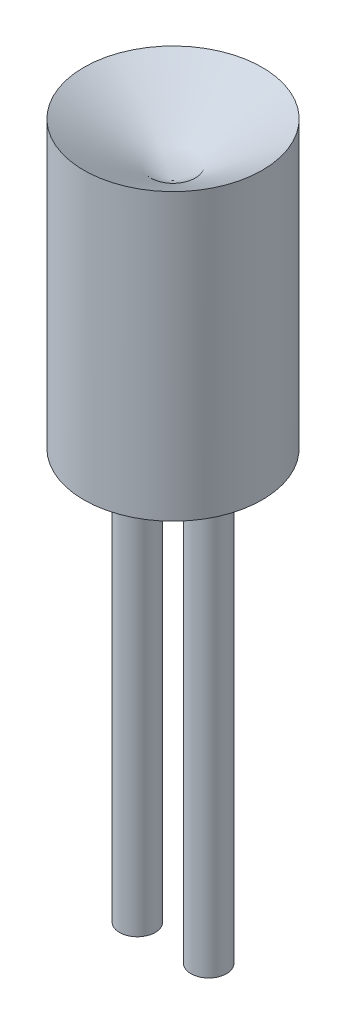
ISO-10303-21;
HEADER;
FILE_DESCRIPTION(('STEP AP214'),'2;1');
FILE_NAME('part.step','',(''),(''),'','','');
FILE_SCHEMA(('AUTOMOTIVE_DESIGN { 1 0 10303 214 1 1 1 1 }'));
ENDSEC;
DATA;
#1=APPLICATION_CONTEXT('core data for automotive mechanical design processes');
#2=APPLICATION_PROTOCOL_DEFINITION('international standard','automotive_design',2000,#1);
#3=PRODUCT_CONTEXT('',#1,'mechanical');
#4=PRODUCT('Part','Part','',(#3));
#5=PRODUCT_RELATED_PRODUCT_CATEGORY('part','',(#4));
#6=PRODUCT_DEFINITION_FORMATION('','',#4);
#7=PRODUCT_DEFINITION_CONTEXT('part definition',#1,'design');
#8=PRODUCT_DEFINITION('design','',#6,#7);
#9=PRODUCT_DEFINITION_SHAPE('','',#8);
#10=(LENGTH_UNIT() NAMED_UNIT(*) SI_UNIT(.MILLI.,.METRE.));
#11=(NAMED_UNIT(*) PLANE_ANGLE_UNIT() SI_UNIT($,.RADIAN.));
#12=(NAMED_UNIT(*) SI_UNIT($,.STERADIAN.) SOLID_ANGLE_UNIT());
#13=UNCERTAINTY_MEASURE_WITH_UNIT(LENGTH_MEASURE(1.E-05),#10,'distance_accuracy_value','');
#14=(GEOMETRIC_REPRESENTATION_CONTEXT(3) GLOBAL_UNCERTAINTY_ASSIGNED_CONTEXT((#13)) GLOBAL_UNIT_ASSIGNED_CONTEXT((#10,
#11,#12)) REPRESENTATION_CONTEXT('',''));
#15=CARTESIAN_POINT('',(0.,0.,0.));
#16=DIRECTION('',(0.,0.,1.));
#17=DIRECTION('',(1.,0.,0.));
#18=AXIS2_PLACEMENT_3D('',#15,#16,#17);
#19=CARTESIAN_POINT('',(0.,8.,0.));
#20=DIRECTION('',(0.,-1.,0.));
#21=DIRECTION('',(0.,0.,-1.));
#22=AXIS2_PLACEMENT_3D('',#19,#20,#21);
#23=CYLINDRICAL_SURFACE('',#22,2.5);
#24=CARTESIAN_POINT('',(0.,8.,0.));
#25=DIRECTION('',(0.,1.,0.));
#26=DIRECTION('',(-1.,0.,0.));
#27=AXIS2_PLACEMENT_3D('',#24,#25,#26);
#28=CIRCLE('',#27,2.5);
#29=CARTESIAN_POINT('',(-2.5,8.,0.));
#30=VERTEX_POINT('',#29);
#31=EDGE_CURVE('E50',#30,#30,#28,.T.);
#32=ORIENTED_EDGE('',*,*,#31,.F.);
#33=EDGE_LOOP('',(#32));
#34=FACE_BOUND('',#33,.T.);
#35=CARTESIAN_POINT('',(0.,0.,0.));
#36=DIRECTION('',(0.,1.,0.));
#37=DIRECTION('',(0.,0.,1.));
#38=AXIS2_PLACEMENT_3D('',#35,#36,#37);
#39=CIRCLE('',#38,2.5);
#40=CARTESIAN_POINT('',(0.,0.,2.5));
#41=VERTEX_POINT('',#40);
#42=EDGE_CURVE('E52',#41,#41,#39,.T.);
#43=ORIENTED_EDGE('',*,*,#42,.T.);
#44=EDGE_LOOP('',(#43));
#45=FACE_BOUND('',#44,.T.);
#46=ADVANCED_FACE('F33',(#34,#45),#23,.T.);
#47=CARTESIAN_POINT('',(0.,0.,0.));
#48=DIRECTION('',(0.,1.,0.));
#49=DIRECTION('',(0.,0.,1.));
#50=AXIS2_PLACEMENT_3D('',#47,#48,#49);
#51=PLANE('',#50);
#52=CARTESIAN_POINT('',(1.,0.,0.));
#53=DIRECTION('',(0.,1.,0.));
#54=DIRECTION('',(0.,0.,1.));
#55=AXIS2_PLACEMENT_3D('',#52,#53,#54);
#56=CIRCLE('',#55,0.5);
#57=CARTESIAN_POINT('',(1.,0.,0.5));
#58=VERTEX_POINT('',#57);
#59=EDGE_CURVE('E11',#58,#58,#56,.F.);
#60=ORIENTED_EDGE('',*,*,#59,.F.);
#61=EDGE_LOOP('',(#60));
#62=FACE_BOUND('',#61,.T.);
#63=CARTESIAN_POINT('',(-1.,0.,0.));
#64=DIRECTION('',(0.,1.,0.));
#65=DIRECTION('',(0.,0.,1.));
#66=AXIS2_PLACEMENT_3D('',#63,#64,#65);
#67=CIRCLE('',#66,0.5);
#68=CARTESIAN_POINT('',(-1.,0.,0.5));
#69=VERTEX_POINT('',#68);
#70=EDGE_CURVE('E39',#69,#69,#67,.F.);
#71=ORIENTED_EDGE('',*,*,#70,.F.);
#72=EDGE_LOOP('',(#71));
#73=FACE_BOUND('',#72,.T.);
#74=ORIENTED_EDGE('',*,*,#42,.F.);
#75=EDGE_LOOP('',(#74));
#76=FACE_BOUND('',#75,.T.);
#77=ADVANCED_FACE('F46',(#62,#73,#76),#51,.F.);
#78=CARTESIAN_POINT('',(0.,8.,0.));
#79=DIRECTION('',(0.,1.,0.));
#80=DIRECTION('',(-1.,0.,0.));
#81=AXIS2_PLACEMENT_3D('',#78,#79,#80);
#82=CONICAL_SURFACE('',#81,2.5,1.03037682652431);
#83=CARTESIAN_POINT('',(0.,6.5,0.));
#84=VERTEX_POINT('',#83);
#85=VERTEX_LOOP('',#84);
#86=FACE_BOUND('',#85,.T.);
#87=ORIENTED_EDGE('',*,*,#31,.T.);
#88=EDGE_LOOP('',(#87));
#89=FACE_BOUND('',#88,.T.);
#90=ADVANCED_FACE('F42',(#86,#89),#82,.F.);
#91=CARTESIAN_POINT('',(-1.,-12.,0.));
#92=DIRECTION('',(0.,1.,0.));
#93=DIRECTION('',(0.,0.,1.));
#94=AXIS2_PLACEMENT_3D('',#91,#92,#93);
#95=CYLINDRICAL_SURFACE('',#94,0.5);
#96=CARTESIAN_POINT('',(-1.,-12.,0.));
#97=DIRECTION('',(0.,-1.,0.));
#98=DIRECTION('',(0.,0.,-1.));
#99=AXIS2_PLACEMENT_3D('',#96,#97,#98);
#100=CIRCLE('',#99,0.5);
#101=CARTESIAN_POINT('',(-1.,-12.,-0.5));
#102=VERTEX_POINT('',#101);
#103=EDGE_CURVE('E53',#102,#102,#100,.T.);
#104=ORIENTED_EDGE('',*,*,#103,.F.);
#105=EDGE_LOOP('',(#104));
#106=FACE_BOUND('',#105,.T.);
#107=ORIENTED_EDGE('',*,*,#70,.T.);
#108=EDGE_LOOP('',(#107));
#109=FACE_BOUND('',#108,.T.);
#110=ADVANCED_FACE('F45',(#106,#109),#95,.T.);
#111=CARTESIAN_POINT('',(-1.,-12.,0.));
#112=DIRECTION('',(0.,-1.,0.));
#113=DIRECTION('',(0.,0.,-1.));
#114=AXIS2_PLACEMENT_3D('',#111,#112,#113);
#115=PLANE('',#114);
#116=ORIENTED_EDGE('',*,*,#103,.T.);
#117=EDGE_LOOP('',(#116));
#118=FACE_BOUND('',#117,.T.);
#119=ADVANCED_FACE('F87',(#118),#115,.T.);
#120=CARTESIAN_POINT('',(1.,-12.,0.));
#121=DIRECTION('',(0.,1.,0.));
#122=DIRECTION('',(0.,0.,1.));
#123=AXIS2_PLACEMENT_3D('',#120,#121,#122);
#124=CYLINDRICAL_SURFACE('',#123,0.5);
#125=CARTESIAN_POINT('',(1.,-12.,0.));
#126=DIRECTION('',(0.,-1.,0.));
#127=DIRECTION('',(0.,0.,1.));
#128=AXIS2_PLACEMENT_3D('',#125,#126,#127);
#129=CIRCLE('',#128,0.5);
#130=CARTESIAN_POINT('',(1.,-12.,0.5));
#131=VERTEX_POINT('',#130);
#132=EDGE_CURVE('E58',#131,#131,#129,.T.);
#133=ORIENTED_EDGE('',*,*,#132,.F.);
#134=EDGE_LOOP('',(#133));
#135=FACE_BOUND('',#134,.T.);
#136=ORIENTED_EDGE('',*,*,#59,.T.);
#137=EDGE_LOOP('',(#136));
#138=FACE_BOUND('',#137,.T.);
#139=ADVANCED_FACE('F95',(#135,#138),#124,.T.);
#140=CARTESIAN_POINT('',(1.,-12.,0.));
#141=DIRECTION('',(0.,1.,0.));
#142=DIRECTION('',(0.,0.,1.));
#143=AXIS2_PLACEMENT_3D('',#140,#141,#142);
#144=PLANE('',#143);
#145=ORIENTED_EDGE('',*,*,#132,.T.);
#146=EDGE_LOOP('',(#145));
#147=FACE_BOUND('',#146,.T.);
#148=ADVANCED_FACE('F103',(#147),#144,.F.);
#149=CLOSED_SHELL('',(#46,#77,#90,#110,#119,#139,#148));
#150=MANIFOLD_SOLID_BREP('B2',#149);
#151=ADVANCED_BREP_SHAPE_REPRESENTATION('',(#18,#150),#14);
#152=SHAPE_DEFINITION_REPRESENTATION(#9,#151);
ENDSEC;
END-ISO-10303-21;
